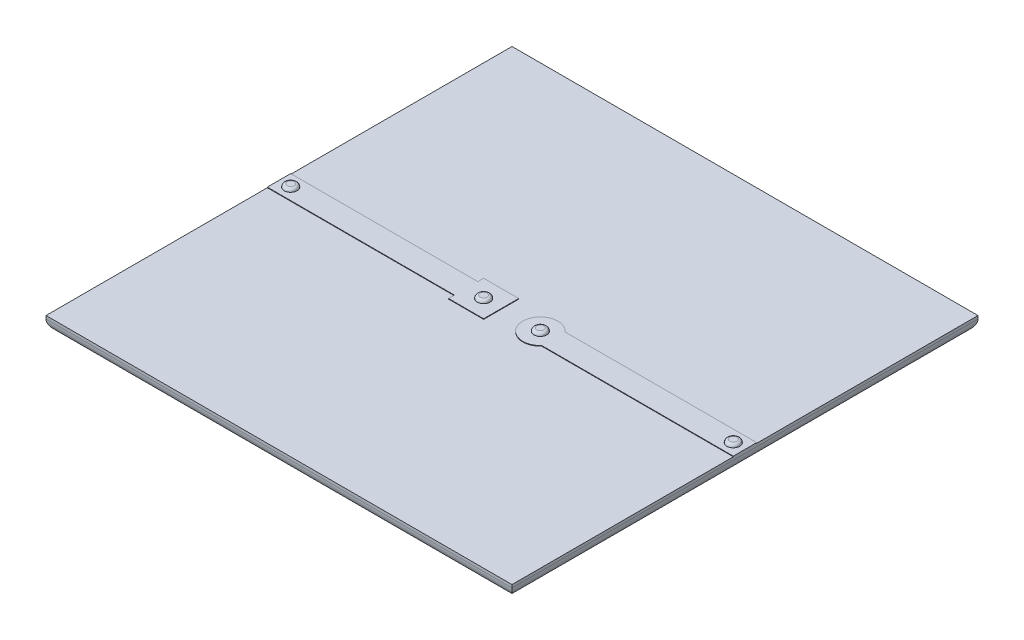
ISO-10303-21;
HEADER;
FILE_DESCRIPTION(('STEP AP214'),'2;1');
FILE_NAME('part.step','',(''),(''),'','','');
FILE_SCHEMA(('AUTOMOTIVE_DESIGN { 1 0 10303 214 1 1 1 1 }'));
ENDSEC;
DATA;
#1=APPLICATION_CONTEXT('core data for automotive mechanical design processes');
#2=APPLICATION_PROTOCOL_DEFINITION('international standard','automotive_design',2000,#1);
#3=PRODUCT_CONTEXT('',#1,'mechanical');
#4=PRODUCT('Part','Part','',(#3));
#5=PRODUCT_RELATED_PRODUCT_CATEGORY('part','',(#4));
#6=PRODUCT_DEFINITION_FORMATION('','',#4);
#7=PRODUCT_DEFINITION_CONTEXT('part definition',#1,'design');
#8=PRODUCT_DEFINITION('design','',#6,#7);
#9=PRODUCT_DEFINITION_SHAPE('','',#8);
#10=(LENGTH_UNIT() NAMED_UNIT(*) SI_UNIT(.MILLI.,.METRE.));
#11=(NAMED_UNIT(*) PLANE_ANGLE_UNIT() SI_UNIT($,.RADIAN.));
#12=(NAMED_UNIT(*) SI_UNIT($,.STERADIAN.) SOLID_ANGLE_UNIT());
#13=UNCERTAINTY_MEASURE_WITH_UNIT(LENGTH_MEASURE(1.E-05),#10,'distance_accuracy_value','');
#14=(GEOMETRIC_REPRESENTATION_CONTEXT(3) GLOBAL_UNCERTAINTY_ASSIGNED_CONTEXT((#13)) GLOBAL_UNIT_ASSIGNED_CONTEXT((#10,
#11,#12)) REPRESENTATION_CONTEXT('',''));
#15=CARTESIAN_POINT('',(0.,0.,0.));
#16=DIRECTION('',(0.,0.,1.));
#17=DIRECTION('',(1.,0.,0.));
#18=AXIS2_PLACEMENT_3D('',#15,#16,#17);
#19=CARTESIAN_POINT('',(0.,0.,0.));
#20=DIRECTION('',(0.,-1.,0.));
#21=DIRECTION('',(0.,0.,-1.));
#22=AXIS2_PLACEMENT_3D('',#19,#20,#21);
#23=PLANE('',#22);
#24=DIRECTION('',(0.,0.,1.));
#25=VECTOR('',#24,1.);
#26=CARTESIAN_POINT('',(-7.84999999999999,0.,-3.));
#27=LINE('',#26,#25);
#28=CARTESIAN_POINT('',(-7.84999999999999,0.,-3.));
#29=VERTEX_POINT('',#28);
#30=CARTESIAN_POINT('',(-7.84999999999999,0.,-2.));
#31=VERTEX_POINT('',#30);
#32=EDGE_CURVE('E394',#29,#31,#27,.T.);
#33=ORIENTED_EDGE('',*,*,#32,.F.);
#34=DIRECTION('',(-1.,0.,0.));
#35=VECTOR('',#34,1.);
#36=CARTESIAN_POINT('',(-7.84999999999999,0.,-3.));
#37=LINE('',#36,#35);
#38=CARTESIAN_POINT('',(-1.84999999999999,0.,-3.));
#39=VERTEX_POINT('',#38);
#40=EDGE_CURVE('E391',#39,#29,#37,.T.);
#41=ORIENTED_EDGE('',*,*,#40,.F.);
#42=DIRECTION('',(0.,0.,-1.));
#43=VECTOR('',#42,1.);
#44=CARTESIAN_POINT('',(-1.84999999999999,0.,-3.));
#45=LINE('',#44,#43);
#46=CARTESIAN_POINT('',(-1.84999999999999,0.,3.));
#47=VERTEX_POINT('',#46);
#48=EDGE_CURVE('E186',#47,#39,#45,.T.);
#49=ORIENTED_EDGE('',*,*,#48,.F.);
#50=DIRECTION('',(1.,0.,0.));
#51=VECTOR('',#50,1.);
#52=CARTESIAN_POINT('',(-7.84999999999999,0.,3.));
#53=LINE('',#52,#51);
#54=CARTESIAN_POINT('',(-7.84999999999999,0.,3.));
#55=VERTEX_POINT('',#54);
#56=EDGE_CURVE('E182',#55,#47,#53,.T.);
#57=ORIENTED_EDGE('',*,*,#56,.F.);
#58=CARTESIAN_POINT('',(-7.84999999999999,0.,2.));
#59=VERTEX_POINT('',#58);
#60=EDGE_CURVE('E393',#59,#55,#27,.T.);
#61=ORIENTED_EDGE('',*,*,#60,.F.);
#62=DIRECTION('',(1.,0.,0.));
#63=VECTOR('',#62,1.);
#64=CARTESIAN_POINT('',(-2.84999999999999,0.,2.));
#65=LINE('',#64,#63);
#66=CARTESIAN_POINT('',(-39.85,0.,1.99999999999999));
#67=VERTEX_POINT('',#66);
#68=EDGE_CURVE('E207',#67,#59,#65,.T.);
#69=ORIENTED_EDGE('',*,*,#68,.F.);
#70=DIRECTION('',(0.,0.,1.));
#71=VECTOR('',#70,1.);
#72=CARTESIAN_POINT('',(-39.85,0.,-39.85));
#73=LINE('',#72,#71);
#74=CARTESIAN_POINT('',(-39.85,0.,39.85));
#75=VERTEX_POINT('',#74);
#76=EDGE_CURVE('E243',#67,#75,#73,.T.);
#77=ORIENTED_EDGE('',*,*,#76,.T.);
#78=DIRECTION('',(1.,0.,0.));
#79=VECTOR('',#78,1.);
#80=CARTESIAN_POINT('',(39.85,0.,39.85));
#81=LINE('',#80,#79);
#82=CARTESIAN_POINT('',(39.85,0.,39.85));
#83=VERTEX_POINT('',#82);
#84=EDGE_CURVE('E242',#75,#83,#81,.T.);
#85=ORIENTED_EDGE('',*,*,#84,.T.);
#86=DIRECTION('',(0.,0.,-1.));
#87=VECTOR('',#86,1.);
#88=CARTESIAN_POINT('',(39.85,0.,-39.85));
#89=LINE('',#88,#87);
#90=CARTESIAN_POINT('',(39.85,0.,2.));
#91=VERTEX_POINT('',#90);
#92=EDGE_CURVE('E247',#83,#91,#89,.T.);
#93=ORIENTED_EDGE('',*,*,#92,.T.);
#94=DIRECTION('',(1.,0.,0.));
#95=VECTOR('',#94,1.);
#96=CARTESIAN_POINT('',(39.85,0.,2.));
#97=LINE('',#96,#95);
#98=CARTESIAN_POINT('',(7.08606797749979,0.,2.));
#99=VERTEX_POINT('',#98);
#100=EDGE_CURVE('E226',#99,#91,#97,.T.);
#101=ORIENTED_EDGE('',*,*,#100,.F.);
#102=CARTESIAN_POINT('',(4.85,0.,0.));
#103=DIRECTION('',(0.,1.,0.));
#104=DIRECTION('',(0.,0.,1.));
#105=AXIS2_PLACEMENT_3D('',#102,#103,#104);
#106=CIRCLE('',#105,3.);
#107=CARTESIAN_POINT('',(7.0860679774998,0.,-2.));
#108=VERTEX_POINT('',#107);
#109=EDGE_CURVE('E197',#108,#99,#106,.T.);
#110=ORIENTED_EDGE('',*,*,#109,.F.);
#111=DIRECTION('',(-1.,0.,0.));
#112=VECTOR('',#111,1.);
#113=CARTESIAN_POINT('',(39.85,0.,-2.));
#114=LINE('',#113,#112);
#115=CARTESIAN_POINT('',(39.85,0.,-1.99999999999999));
#116=VERTEX_POINT('',#115);
#117=EDGE_CURVE('E221',#116,#108,#114,.T.);
#118=ORIENTED_EDGE('',*,*,#117,.F.);
#119=CARTESIAN_POINT('',(39.85,0.,-39.85));
#120=VERTEX_POINT('',#119);
#121=EDGE_CURVE('E246',#116,#120,#89,.T.);
#122=ORIENTED_EDGE('',*,*,#121,.T.);
#123=DIRECTION('',(-1.,0.,0.));
#124=VECTOR('',#123,1.);
#125=CARTESIAN_POINT('',(39.85,0.,-39.85));
#126=LINE('',#125,#124);
#127=CARTESIAN_POINT('',(-39.85,0.,-39.85));
#128=VERTEX_POINT('',#127);
#129=EDGE_CURVE('E250',#120,#128,#126,.T.);
#130=ORIENTED_EDGE('',*,*,#129,.T.);
#131=CARTESIAN_POINT('',(-39.85,0.,-2.));
#132=VERTEX_POINT('',#131);
#133=EDGE_CURVE('E240',#128,#132,#73,.T.);
#134=ORIENTED_EDGE('',*,*,#133,.T.);
#135=DIRECTION('',(-1.,0.,0.));
#136=VECTOR('',#135,1.);
#137=CARTESIAN_POINT('',(-2.84999999999999,0.,-2.));
#138=LINE('',#137,#136);
#139=EDGE_CURVE('E58',#31,#132,#138,.T.);
#140=ORIENTED_EDGE('',*,*,#139,.F.);
#141=EDGE_LOOP('',(#33,#41,#49,#57,#61,#69,#77,#85,#93,#101,#110,#118,#122,#130,#134,#140));
#142=FACE_BOUND('',#141,.T.);
#143=ADVANCED_FACE('F35',(#142),#23,.F.);
#144=CARTESIAN_POINT('',(-2.84999999999999,0.1,-2.));
#145=DIRECTION('',(0.,0.,1.));
#146=DIRECTION('',(1.,0.,0.));
#147=AXIS2_PLACEMENT_3D('',#144,#145,#146);
#148=PLANE('',#147);
#149=DIRECTION('',(0.,1.,0.));
#150=VECTOR('',#149,1.);
#151=CARTESIAN_POINT('',(-7.84999999999999,0.1,-2.));
#152=LINE('',#151,#150);
#153=CARTESIAN_POINT('',(-7.84999999999999,0.1,-2.));
#154=VERTEX_POINT('',#153);
#155=EDGE_CURVE('E190',#31,#154,#152,.T.);
#156=ORIENTED_EDGE('',*,*,#155,.F.);
#157=ORIENTED_EDGE('',*,*,#139,.T.);
#158=DIRECTION('',(0.,-1.,0.));
#159=VECTOR('',#158,1.);
#160=CARTESIAN_POINT('',(-39.85,0.1,-1.99999999999999));
#161=LINE('',#160,#159);
#162=CARTESIAN_POINT('',(-39.85,0.1,-1.99999999999999));
#163=VERTEX_POINT('',#162);
#164=EDGE_CURVE('E218',#163,#132,#161,.T.);
#165=ORIENTED_EDGE('',*,*,#164,.F.);
#166=DIRECTION('',(-1.,0.,0.));
#167=VECTOR('',#166,1.);
#168=CARTESIAN_POINT('',(-2.84999999999999,0.1,-2.));
#169=LINE('',#168,#167);
#170=EDGE_CURVE('E204',#154,#163,#169,.T.);
#171=ORIENTED_EDGE('',*,*,#170,.F.);
#172=EDGE_LOOP('',(#156,#157,#165,#171));
#173=FACE_BOUND('',#172,.T.);
#174=ADVANCED_FACE('F314',(#173),#148,.F.);
#175=CARTESIAN_POINT('',(-2.84999999999999,0.1,2.));
#176=DIRECTION('',(0.,0.,-1.));
#177=DIRECTION('',(-1.,0.,0.));
#178=AXIS2_PLACEMENT_3D('',#175,#176,#177);
#179=PLANE('',#178);
#180=DIRECTION('',(0.,-1.,0.));
#181=VECTOR('',#180,1.);
#182=CARTESIAN_POINT('',(-7.84999999999999,0.1,2.));
#183=LINE('',#182,#181);
#184=CARTESIAN_POINT('',(-7.84999999999999,0.1,2.));
#185=VERTEX_POINT('',#184);
#186=EDGE_CURVE('E188',#185,#59,#183,.T.);
#187=ORIENTED_EDGE('',*,*,#186,.F.);
#188=DIRECTION('',(1.,0.,0.));
#189=VECTOR('',#188,1.);
#190=CARTESIAN_POINT('',(-2.84999999999999,0.1,2.));
#191=LINE('',#190,#189);
#192=CARTESIAN_POINT('',(-39.85,0.1,1.99999999999999));
#193=VERTEX_POINT('',#192);
#194=EDGE_CURVE('E209',#193,#185,#191,.T.);
#195=ORIENTED_EDGE('',*,*,#194,.F.);
#196=DIRECTION('',(0.,-1.,0.));
#197=VECTOR('',#196,1.);
#198=CARTESIAN_POINT('',(-39.85,0.1,1.99999999999999));
#199=LINE('',#198,#197);
#200=EDGE_CURVE('E212',#193,#67,#199,.T.);
#201=ORIENTED_EDGE('',*,*,#200,.T.);
#202=ORIENTED_EDGE('',*,*,#68,.T.);
#203=EDGE_LOOP('',(#187,#195,#201,#202));
#204=FACE_BOUND('',#203,.T.);
#205=ADVANCED_FACE('F320',(#204),#179,.F.);
#206=CARTESIAN_POINT('',(39.85,0.1,-2.));
#207=DIRECTION('',(0.,0.,1.));
#208=DIRECTION('',(1.,0.,0.));
#209=AXIS2_PLACEMENT_3D('',#206,#207,#208);
#210=PLANE('',#209);
#211=DIRECTION('',(0.,-1.,0.));
#212=VECTOR('',#211,1.);
#213=CARTESIAN_POINT('',(7.0860679774998,0.1,-2.));
#214=LINE('',#213,#212);
#215=CARTESIAN_POINT('',(7.0860679774998,0.1,-2.));
#216=VERTEX_POINT('',#215);
#217=EDGE_CURVE('E202',#216,#108,#214,.T.);
#218=ORIENTED_EDGE('',*,*,#217,.F.);
#219=DIRECTION('',(-1.,0.,0.));
#220=VECTOR('',#219,1.);
#221=CARTESIAN_POINT('',(39.85,0.1,-2.));
#222=LINE('',#221,#220);
#223=CARTESIAN_POINT('',(39.85,0.1,-2.));
#224=VERTEX_POINT('',#223);
#225=EDGE_CURVE('E225',#224,#216,#222,.T.);
#226=ORIENTED_EDGE('',*,*,#225,.F.);
#227=DIRECTION('',(0.,-1.,0.));
#228=VECTOR('',#227,1.);
#229=CARTESIAN_POINT('',(39.85,0.1,-2.));
#230=LINE('',#229,#228);
#231=EDGE_CURVE('E236',#224,#116,#230,.T.);
#232=ORIENTED_EDGE('',*,*,#231,.T.);
#233=ORIENTED_EDGE('',*,*,#117,.T.);
#234=EDGE_LOOP('',(#218,#226,#232,#233));
#235=FACE_BOUND('',#234,.T.);
#236=ADVANCED_FACE('F435',(#235),#210,.F.);
#237=CARTESIAN_POINT('',(39.85,0.1,2.));
#238=DIRECTION('',(0.,0.,-1.));
#239=DIRECTION('',(-1.,0.,0.));
#240=AXIS2_PLACEMENT_3D('',#237,#238,#239);
#241=PLANE('',#240);
#242=DIRECTION('',(0.,-1.,0.));
#243=VECTOR('',#242,1.);
#244=CARTESIAN_POINT('',(7.08606797749979,0.1,2.));
#245=LINE('',#244,#243);
#246=CARTESIAN_POINT('',(7.08606797749979,0.1,2.));
#247=VERTEX_POINT('',#246);
#248=EDGE_CURVE('E199',#99,#247,#245,.F.);
#249=ORIENTED_EDGE('',*,*,#248,.F.);
#250=ORIENTED_EDGE('',*,*,#100,.T.);
#251=DIRECTION('',(0.,-1.,0.));
#252=VECTOR('',#251,1.);
#253=CARTESIAN_POINT('',(39.85,0.1,2.));
#254=LINE('',#253,#252);
#255=CARTESIAN_POINT('',(39.85,0.1,2.));
#256=VERTEX_POINT('',#255);
#257=EDGE_CURVE('E230',#256,#91,#254,.T.);
#258=ORIENTED_EDGE('',*,*,#257,.F.);
#259=DIRECTION('',(1.,0.,0.));
#260=VECTOR('',#259,1.);
#261=CARTESIAN_POINT('',(39.85,0.1,2.));
#262=LINE('',#261,#260);
#263=EDGE_CURVE('E228',#247,#256,#262,.T.);
#264=ORIENTED_EDGE('',*,*,#263,.F.);
#265=EDGE_LOOP('',(#249,#250,#258,#264));
#266=FACE_BOUND('',#265,.T.);
#267=ADVANCED_FACE('F342',(#266),#241,.F.);
#268=CARTESIAN_POINT('',(-39.85,-2.5,-39.85));
#269=DIRECTION('',(-1.,0.,0.));
#270=DIRECTION('',(0.,0.,1.));
#271=AXIS2_PLACEMENT_3D('',#268,#269,#270);
#272=PLANE('',#271);
#273=DIRECTION('',(0.,1.,0.));
#274=VECTOR('',#273,1.);
#275=CARTESIAN_POINT('',(-39.85,-2.5,-39.85));
#276=LINE('',#275,#274);
#277=CARTESIAN_POINT('',(-39.85,-0.5,-39.85));
#278=VERTEX_POINT('',#277);
#279=EDGE_CURVE('E254',#278,#128,#276,.T.);
#280=ORIENTED_EDGE('',*,*,#279,.F.);
#281=DIRECTION('',(0.,0.,1.));
#282=VECTOR('',#281,1.);
#283=CARTESIAN_POINT('',(-39.85,-0.5,-39.85));
#284=LINE('',#283,#282);
#285=CARTESIAN_POINT('',(-39.85,-0.5,39.85));
#286=VERTEX_POINT('',#285);
#287=EDGE_CURVE('E256',#278,#286,#284,.T.);
#288=ORIENTED_EDGE('',*,*,#287,.T.);
#289=DIRECTION('',(0.,1.,0.));
#290=VECTOR('',#289,1.);
#291=CARTESIAN_POINT('',(-39.85,-2.5,39.85));
#292=LINE('',#291,#290);
#293=EDGE_CURVE('E253',#286,#75,#292,.T.);
#294=ORIENTED_EDGE('',*,*,#293,.T.);
#295=ORIENTED_EDGE('',*,*,#76,.F.);
#296=ORIENTED_EDGE('',*,*,#200,.F.);
#297=DIRECTION('',(0.,0.,1.));
#298=VECTOR('',#297,1.);
#299=CARTESIAN_POINT('',(-39.85,0.1,1.99999999999999));
#300=LINE('',#299,#298);
#301=EDGE_CURVE('E206',#163,#193,#300,.T.);
#302=ORIENTED_EDGE('',*,*,#301,.F.);
#303=ORIENTED_EDGE('',*,*,#164,.T.);
#304=ORIENTED_EDGE('',*,*,#133,.F.);
#305=EDGE_LOOP('',(#280,#288,#294,#295,#296,#302,#303,#304));
#306=FACE_BOUND('',#305,.T.);
#307=ADVANCED_FACE('F331',(#306),#272,.T.);
#308=CARTESIAN_POINT('',(39.85,-2.5,-39.85));
#309=DIRECTION('',(0.,0.,-1.));
#310=DIRECTION('',(-1.,0.,0.));
#311=AXIS2_PLACEMENT_3D('',#308,#309,#310);
#312=PLANE('',#311);
#313=DIRECTION('',(0.,1.,0.));
#314=VECTOR('',#313,1.);
#315=CARTESIAN_POINT('',(39.85,-2.5,-39.85));
#316=LINE('',#315,#314);
#317=CARTESIAN_POINT('',(39.85,-0.5,-39.85));
#318=VERTEX_POINT('',#317);
#319=EDGE_CURVE('E257',#318,#120,#316,.T.);
#320=ORIENTED_EDGE('',*,*,#319,.F.);
#321=DIRECTION('',(-1.,0.,0.));
#322=VECTOR('',#321,1.);
#323=CARTESIAN_POINT('',(39.85,-0.5,-39.85));
#324=LINE('',#323,#322);
#325=EDGE_CURVE('E275',#318,#278,#324,.T.);
#326=ORIENTED_EDGE('',*,*,#325,.T.);
#327=ORIENTED_EDGE('',*,*,#279,.T.);
#328=ORIENTED_EDGE('',*,*,#129,.F.);
#329=EDGE_LOOP('',(#320,#326,#327,#328));
#330=FACE_BOUND('',#329,.T.);
#331=ADVANCED_FACE('F327',(#330),#312,.T.);
#332=CARTESIAN_POINT('',(39.85,-2.5,-39.85));
#333=DIRECTION('',(1.,0.,0.));
#334=DIRECTION('',(0.,0.,-1.));
#335=AXIS2_PLACEMENT_3D('',#332,#333,#334);
#336=PLANE('',#335);
#337=DIRECTION('',(0.,1.,0.));
#338=VECTOR('',#337,1.);
#339=CARTESIAN_POINT('',(39.85,-2.5,39.85));
#340=LINE('',#339,#338);
#341=CARTESIAN_POINT('',(39.85,-0.5,39.85));
#342=VERTEX_POINT('',#341);
#343=EDGE_CURVE('E260',#342,#83,#340,.T.);
#344=ORIENTED_EDGE('',*,*,#343,.F.);
#345=DIRECTION('',(0.,0.,-1.));
#346=VECTOR('',#345,1.);
#347=CARTESIAN_POINT('',(39.85,-0.5,-39.85));
#348=LINE('',#347,#346);
#349=EDGE_CURVE('E277',#342,#318,#348,.T.);
#350=ORIENTED_EDGE('',*,*,#349,.T.);
#351=ORIENTED_EDGE('',*,*,#319,.T.);
#352=ORIENTED_EDGE('',*,*,#121,.F.);
#353=ORIENTED_EDGE('',*,*,#231,.F.);
#354=DIRECTION('',(0.,0.,-1.));
#355=VECTOR('',#354,1.);
#356=CARTESIAN_POINT('',(39.85,0.1,2.));
#357=LINE('',#356,#355);
#358=EDGE_CURVE('E222',#256,#224,#357,.T.);
#359=ORIENTED_EDGE('',*,*,#358,.F.);
#360=ORIENTED_EDGE('',*,*,#257,.T.);
#361=ORIENTED_EDGE('',*,*,#92,.F.);
#362=EDGE_LOOP('',(#344,#350,#351,#352,#353,#359,#360,#361));
#363=FACE_BOUND('',#362,.T.);
#364=ADVANCED_FACE('F330',(#363),#336,.T.);
#365=CARTESIAN_POINT('',(39.85,-2.5,39.85));
#366=DIRECTION('',(0.,0.,1.));
#367=DIRECTION('',(1.,0.,0.));
#368=AXIS2_PLACEMENT_3D('',#365,#366,#367);
#369=PLANE('',#368);
#370=ORIENTED_EDGE('',*,*,#293,.F.);
#371=DIRECTION('',(1.,0.,0.));
#372=VECTOR('',#371,1.);
#373=CARTESIAN_POINT('',(39.85,-0.5,39.85));
#374=LINE('',#373,#372);
#375=EDGE_CURVE('E279',#286,#342,#374,.T.);
#376=ORIENTED_EDGE('',*,*,#375,.T.);
#377=ORIENTED_EDGE('',*,*,#343,.T.);
#378=ORIENTED_EDGE('',*,*,#84,.F.);
#379=EDGE_LOOP('',(#370,#376,#377,#378));
#380=FACE_BOUND('',#379,.T.);
#381=ADVANCED_FACE('F335',(#380),#369,.T.);
#382=CARTESIAN_POINT('',(0.,-2.5,0.));
#383=DIRECTION('',(0.,-1.,0.));
#384=DIRECTION('',(0.,0.,-1.));
#385=AXIS2_PLACEMENT_3D('',#382,#383,#384);
#386=PLANE('',#385);
#387=DIRECTION('',(1.,0.,0.));
#388=VECTOR('',#387,1.);
#389=CARTESIAN_POINT('',(0.,-2.5,37.85));
#390=LINE('',#389,#388);
#391=CARTESIAN_POINT('',(37.85,-2.5,37.85));
#392=VERTEX_POINT('',#391);
#393=CARTESIAN_POINT('',(-37.85,-2.5,37.85));
#394=VERTEX_POINT('',#393);
#395=EDGE_CURVE('E266',#392,#394,#390,.F.);
#396=ORIENTED_EDGE('',*,*,#395,.T.);
#397=DIRECTION('',(0.,0.,1.));
#398=VECTOR('',#397,1.);
#399=CARTESIAN_POINT('',(-37.85,-2.5,0.));
#400=LINE('',#399,#398);
#401=CARTESIAN_POINT('',(-37.85,-2.5,-37.85));
#402=VERTEX_POINT('',#401);
#403=EDGE_CURVE('E272',#394,#402,#400,.F.);
#404=ORIENTED_EDGE('',*,*,#403,.T.);
#405=DIRECTION('',(-1.,0.,0.));
#406=VECTOR('',#405,1.);
#407=CARTESIAN_POINT('',(0.,-2.5,-37.85));
#408=LINE('',#407,#406);
#409=CARTESIAN_POINT('',(37.85,-2.5,-37.85));
#410=VERTEX_POINT('',#409);
#411=EDGE_CURVE('E270',#402,#410,#408,.F.);
#412=ORIENTED_EDGE('',*,*,#411,.T.);
#413=DIRECTION('',(0.,0.,-1.));
#414=VECTOR('',#413,1.);
#415=CARTESIAN_POINT('',(37.85,-2.5,0.));
#416=LINE('',#415,#414);
#417=EDGE_CURVE('E268',#410,#392,#416,.F.);
#418=ORIENTED_EDGE('',*,*,#417,.T.);
#419=EDGE_LOOP('',(#396,#404,#412,#418));
#420=FACE_BOUND('',#419,.T.);
#421=ADVANCED_FACE('F325',(#420),#386,.T.);
#422=CARTESIAN_POINT('',(37.85,-0.5,-39.85));
#423=DIRECTION('',(0.,0.,-1.));
#424=DIRECTION('',(-1.,0.,0.));
#425=AXIS2_PLACEMENT_3D('',#422,#423,#424);
#426=CYLINDRICAL_SURFACE('',#425,2.);
#427=CARTESIAN_POINT('',(37.85,-0.5,37.85));
#428=DIRECTION('',(0.707106781186547,0.,-0.707106781186548));
#429=DIRECTION('',(0.707106781186548,0.,0.707106781186547));
#430=AXIS2_PLACEMENT_3D('',#427,#428,#429);
#431=ELLIPSE('',#430,2.82842712474619,2.);
#432=EDGE_CURVE('E285',#392,#342,#431,.F.);
#433=ORIENTED_EDGE('',*,*,#432,.F.);
#434=ORIENTED_EDGE('',*,*,#417,.F.);
#435=CARTESIAN_POINT('',(37.85,-0.5,-37.85));
#436=DIRECTION('',(-0.707106781186548,0.,-0.707106781186547));
#437=DIRECTION('',(0.707106781186547,0.,-0.707106781186548));
#438=AXIS2_PLACEMENT_3D('',#435,#436,#437);
#439=ELLIPSE('',#438,2.82842712474619,2.);
#440=EDGE_CURVE('E288',#318,#410,#439,.T.);
#441=ORIENTED_EDGE('',*,*,#440,.F.);
#442=ORIENTED_EDGE('',*,*,#349,.F.);
#443=EDGE_LOOP('',(#433,#434,#441,#442));
#444=FACE_BOUND('',#443,.T.);
#445=ADVANCED_FACE('F356',(#444),#426,.T.);
#446=CARTESIAN_POINT('',(39.85,-0.5,-37.85));
#447=DIRECTION('',(-1.,0.,0.));
#448=DIRECTION('',(0.,0.,1.));
#449=AXIS2_PLACEMENT_3D('',#446,#447,#448);
#450=CYLINDRICAL_SURFACE('',#449,2.);
#451=ORIENTED_EDGE('',*,*,#440,.T.);
#452=ORIENTED_EDGE('',*,*,#411,.F.);
#453=CARTESIAN_POINT('',(-37.85,-0.5,-37.85));
#454=DIRECTION('',(-0.707106781186547,0.,0.707106781186548));
#455=DIRECTION('',(-0.707106781186548,0.,-0.707106781186547));
#456=AXIS2_PLACEMENT_3D('',#453,#454,#455);
#457=ELLIPSE('',#456,2.82842712474619,2.);
#458=EDGE_CURVE('E283',#278,#402,#457,.T.);
#459=ORIENTED_EDGE('',*,*,#458,.F.);
#460=ORIENTED_EDGE('',*,*,#325,.F.);
#461=EDGE_LOOP('',(#451,#452,#459,#460));
#462=FACE_BOUND('',#461,.T.);
#463=ADVANCED_FACE('F352',(#462),#450,.T.);
#464=CARTESIAN_POINT('',(39.85,-0.5,37.85));
#465=DIRECTION('',(1.,0.,0.));
#466=DIRECTION('',(0.,0.,-1.));
#467=AXIS2_PLACEMENT_3D('',#464,#465,#466);
#468=CYLINDRICAL_SURFACE('',#467,2.);
#469=ORIENTED_EDGE('',*,*,#432,.T.);
#470=ORIENTED_EDGE('',*,*,#375,.F.);
#471=CARTESIAN_POINT('',(-37.85,-0.5,37.85));
#472=DIRECTION('',(0.707106781186548,0.,0.707106781186547));
#473=DIRECTION('',(0.707106781186547,0.,-0.707106781186548));
#474=AXIS2_PLACEMENT_3D('',#471,#472,#473);
#475=ELLIPSE('',#474,2.82842712474619,2.);
#476=EDGE_CURVE('E239',#394,#286,#475,.F.);
#477=ORIENTED_EDGE('',*,*,#476,.F.);
#478=ORIENTED_EDGE('',*,*,#395,.F.);
#479=EDGE_LOOP('',(#469,#470,#477,#478));
#480=FACE_BOUND('',#479,.T.);
#481=ADVANCED_FACE('F348',(#480),#468,.T.);
#482=CARTESIAN_POINT('',(-37.85,-0.5,-39.85));
#483=DIRECTION('',(0.,0.,1.));
#484=DIRECTION('',(1.,0.,0.));
#485=AXIS2_PLACEMENT_3D('',#482,#483,#484);
#486=CYLINDRICAL_SURFACE('',#485,2.);
#487=ORIENTED_EDGE('',*,*,#458,.T.);
#488=ORIENTED_EDGE('',*,*,#403,.F.);
#489=ORIENTED_EDGE('',*,*,#476,.T.);
#490=ORIENTED_EDGE('',*,*,#287,.F.);
#491=EDGE_LOOP('',(#487,#488,#489,#490));
#492=FACE_BOUND('',#491,.T.);
#493=ADVANCED_FACE('F344',(#492),#486,.T.);
#494=CARTESIAN_POINT('',(0.,0.1,0.));
#495=DIRECTION('',(0.,1.,0.));
#496=DIRECTION('',(0.,0.,1.));
#497=AXIS2_PLACEMENT_3D('',#494,#495,#496);
#498=PLANE('',#497);
#499=CARTESIAN_POINT('',(37.85,0.1,0.));
#500=DIRECTION('',(0.,1.,0.));
#501=DIRECTION('',(0.,0.,1.));
#502=AXIS2_PLACEMENT_3D('',#499,#500,#501);
#503=CIRCLE('',#502,1.1);
#504=CARTESIAN_POINT('',(37.85,0.1,1.1));
#505=VERTEX_POINT('',#504);
#506=EDGE_CURVE('E376',#505,#505,#503,.T.);
#507=ORIENTED_EDGE('',*,*,#506,.F.);
#508=EDGE_LOOP('',(#507));
#509=FACE_BOUND('',#508,.T.);
#510=CARTESIAN_POINT('',(4.85,0.1,0.));
#511=DIRECTION('',(0.,1.,0.));
#512=DIRECTION('',(0.,0.,1.));
#513=AXIS2_PLACEMENT_3D('',#510,#511,#512);
#514=CIRCLE('',#513,1.1);
#515=CARTESIAN_POINT('',(4.85,0.1,1.1));
#516=VERTEX_POINT('',#515);
#517=EDGE_CURVE('E384',#516,#516,#514,.T.);
#518=ORIENTED_EDGE('',*,*,#517,.F.);
#519=EDGE_LOOP('',(#518));
#520=FACE_BOUND('',#519,.T.);
#521=ORIENTED_EDGE('',*,*,#225,.T.);
#522=CARTESIAN_POINT('',(4.85,0.1,0.));
#523=DIRECTION('',(0.,1.,0.));
#524=DIRECTION('',(0.,0.,1.));
#525=AXIS2_PLACEMENT_3D('',#522,#523,#524);
#526=CIRCLE('',#525,3.);
#527=EDGE_CURVE('E50',#216,#247,#526,.T.);
#528=ORIENTED_EDGE('',*,*,#527,.T.);
#529=ORIENTED_EDGE('',*,*,#263,.T.);
#530=ORIENTED_EDGE('',*,*,#358,.T.);
#531=EDGE_LOOP('',(#521,#528,#529,#530));
#532=FACE_BOUND('',#531,.T.);
#533=ADVANCED_FACE('F347',(#509,#520,#532),#498,.T.);
#534=CARTESIAN_POINT('',(0.,0.1,0.));
#535=DIRECTION('',(0.,1.,0.));
#536=DIRECTION('',(0.,0.,1.));
#537=AXIS2_PLACEMENT_3D('',#534,#535,#536);
#538=PLANE('',#537);
#539=CARTESIAN_POINT('',(-37.85,0.1,0.));
#540=DIRECTION('',(0.,1.,0.));
#541=DIRECTION('',(0.,0.,1.));
#542=AXIS2_PLACEMENT_3D('',#539,#540,#541);
#543=CIRCLE('',#542,1.1);
#544=CARTESIAN_POINT('',(-37.85,0.1,1.1));
#545=VERTEX_POINT('',#544);
#546=EDGE_CURVE('E373',#545,#545,#543,.T.);
#547=ORIENTED_EDGE('',*,*,#546,.F.);
#548=EDGE_LOOP('',(#547));
#549=FACE_BOUND('',#548,.T.);
#550=CARTESIAN_POINT('',(-4.84999999999999,0.1,0.));
#551=DIRECTION('',(0.,1.,0.));
#552=DIRECTION('',(0.,0.,1.));
#553=AXIS2_PLACEMENT_3D('',#550,#551,#552);
#554=CIRCLE('',#553,1.1);
#555=CARTESIAN_POINT('',(-4.84999999999999,0.1,1.1));
#556=VERTEX_POINT('',#555);
#557=EDGE_CURVE('E379',#556,#556,#554,.T.);
#558=ORIENTED_EDGE('',*,*,#557,.F.);
#559=EDGE_LOOP('',(#558));
#560=FACE_BOUND('',#559,.T.);
#561=DIRECTION('',(0.,0.,1.));
#562=VECTOR('',#561,1.);
#563=CARTESIAN_POINT('',(-7.84999999999999,0.1,-3.));
#564=LINE('',#563,#562);
#565=CARTESIAN_POINT('',(-7.84999999999999,0.1,-3.));
#566=VERTEX_POINT('',#565);
#567=EDGE_CURVE('E386',#566,#154,#564,.T.);
#568=ORIENTED_EDGE('',*,*,#567,.T.);
#569=ORIENTED_EDGE('',*,*,#170,.T.);
#570=ORIENTED_EDGE('',*,*,#301,.T.);
#571=ORIENTED_EDGE('',*,*,#194,.T.);
#572=CARTESIAN_POINT('',(-7.84999999999999,0.1,3.));
#573=VERTEX_POINT('',#572);
#574=EDGE_CURVE('E172',#185,#573,#564,.T.);
#575=ORIENTED_EDGE('',*,*,#574,.T.);
#576=DIRECTION('',(1.,0.,0.));
#577=VECTOR('',#576,1.);
#578=CARTESIAN_POINT('',(-7.84999999999999,0.1,3.));
#579=LINE('',#578,#577);
#580=CARTESIAN_POINT('',(-1.84999999999999,0.1,3.));
#581=VERTEX_POINT('',#580);
#582=EDGE_CURVE('E178',#573,#581,#579,.T.);
#583=ORIENTED_EDGE('',*,*,#582,.T.);
#584=DIRECTION('',(0.,0.,-1.));
#585=VECTOR('',#584,1.);
#586=CARTESIAN_POINT('',(-1.84999999999999,0.1,-3.));
#587=LINE('',#586,#585);
#588=CARTESIAN_POINT('',(-1.84999999999999,0.1,-3.));
#589=VERTEX_POINT('',#588);
#590=EDGE_CURVE('E173',#581,#589,#587,.T.);
#591=ORIENTED_EDGE('',*,*,#590,.T.);
#592=DIRECTION('',(-1.,0.,0.));
#593=VECTOR('',#592,1.);
#594=CARTESIAN_POINT('',(-7.84999999999999,0.1,-3.));
#595=LINE('',#594,#593);
#596=EDGE_CURVE('E161',#589,#566,#595,.T.);
#597=ORIENTED_EDGE('',*,*,#596,.T.);
#598=EDGE_LOOP('',(#568,#569,#570,#571,#575,#583,#591,#597));
#599=FACE_BOUND('',#598,.T.);
#600=ADVANCED_FACE('F176',(#549,#560,#599),#538,.T.);
#601=CARTESIAN_POINT('',(4.85,0.1,0.));
#602=DIRECTION('',(0.,-1.,0.));
#603=DIRECTION('',(0.,0.,-1.));
#604=AXIS2_PLACEMENT_3D('',#601,#602,#603);
#605=CYLINDRICAL_SURFACE('',#604,3.);
#606=ORIENTED_EDGE('',*,*,#527,.F.);
#607=ORIENTED_EDGE('',*,*,#217,.T.);
#608=ORIENTED_EDGE('',*,*,#109,.T.);
#609=ORIENTED_EDGE('',*,*,#248,.T.);
#610=EDGE_LOOP('',(#606,#607,#608,#609));
#611=FACE_BOUND('',#610,.T.);
#612=ADVANCED_FACE('F423',(#611),#605,.T.);
#613=CARTESIAN_POINT('',(-7.84999999999999,0.1,-3.));
#614=DIRECTION('',(1.,0.,0.));
#615=DIRECTION('',(0.,0.,-1.));
#616=AXIS2_PLACEMENT_3D('',#613,#614,#615);
#617=PLANE('',#616);
#618=ORIENTED_EDGE('',*,*,#32,.T.);
#619=ORIENTED_EDGE('',*,*,#155,.T.);
#620=ORIENTED_EDGE('',*,*,#567,.F.);
#621=DIRECTION('',(0.,-1.,0.));
#622=VECTOR('',#621,1.);
#623=CARTESIAN_POINT('',(-7.84999999999999,0.1,-3.));
#624=LINE('',#623,#622);
#625=EDGE_CURVE('E168',#566,#29,#624,.T.);
#626=ORIENTED_EDGE('',*,*,#625,.T.);
#627=EDGE_LOOP('',(#618,#619,#620,#626));
#628=FACE_BOUND('',#627,.T.);
#629=ADVANCED_FACE('F406',(#628),#617,.F.);
#630=ORIENTED_EDGE('',*,*,#574,.F.);
#631=ORIENTED_EDGE('',*,*,#186,.T.);
#632=ORIENTED_EDGE('',*,*,#60,.T.);
#633=DIRECTION('',(0.,-1.,0.));
#634=VECTOR('',#633,1.);
#635=CARTESIAN_POINT('',(-7.84999999999999,0.1,3.));
#636=LINE('',#635,#634);
#637=EDGE_CURVE('E192',#573,#55,#636,.T.);
#638=ORIENTED_EDGE('',*,*,#637,.F.);
#639=EDGE_LOOP('',(#630,#631,#632,#638));
#640=FACE_BOUND('',#639,.T.);
#641=ADVANCED_FACE('F415',(#640),#617,.F.);
#642=CARTESIAN_POINT('',(-1.84999999999999,0.1,-3.));
#643=DIRECTION('',(-1.,0.,0.));
#644=DIRECTION('',(0.,0.,1.));
#645=AXIS2_PLACEMENT_3D('',#642,#643,#644);
#646=PLANE('',#645);
#647=ORIENTED_EDGE('',*,*,#48,.T.);
#648=DIRECTION('',(0.,-1.,0.));
#649=VECTOR('',#648,1.);
#650=CARTESIAN_POINT('',(-1.84999999999999,0.1,-3.));
#651=LINE('',#650,#649);
#652=EDGE_CURVE('E165',#589,#39,#651,.T.);
#653=ORIENTED_EDGE('',*,*,#652,.F.);
#654=ORIENTED_EDGE('',*,*,#590,.F.);
#655=DIRECTION('',(0.,-1.,0.));
#656=VECTOR('',#655,1.);
#657=CARTESIAN_POINT('',(-1.84999999999999,0.1,3.));
#658=LINE('',#657,#656);
#659=EDGE_CURVE('E389',#581,#47,#658,.T.);
#660=ORIENTED_EDGE('',*,*,#659,.T.);
#661=EDGE_LOOP('',(#647,#653,#654,#660));
#662=FACE_BOUND('',#661,.T.);
#663=ADVANCED_FACE('F184',(#662),#646,.F.);
#664=CARTESIAN_POINT('',(-7.84999999999999,0.1,-3.));
#665=DIRECTION('',(0.,0.,1.));
#666=DIRECTION('',(1.,0.,0.));
#667=AXIS2_PLACEMENT_3D('',#664,#665,#666);
#668=PLANE('',#667);
#669=ORIENTED_EDGE('',*,*,#40,.T.);
#670=ORIENTED_EDGE('',*,*,#625,.F.);
#671=ORIENTED_EDGE('',*,*,#596,.F.);
#672=ORIENTED_EDGE('',*,*,#652,.T.);
#673=EDGE_LOOP('',(#669,#670,#671,#672));
#674=FACE_BOUND('',#673,.T.);
#675=ADVANCED_FACE('F163',(#674),#668,.F.);
#676=CARTESIAN_POINT('',(-7.84999999999999,0.1,3.));
#677=DIRECTION('',(0.,0.,-1.));
#678=DIRECTION('',(-1.,0.,0.));
#679=AXIS2_PLACEMENT_3D('',#676,#677,#678);
#680=PLANE('',#679);
#681=ORIENTED_EDGE('',*,*,#56,.T.);
#682=ORIENTED_EDGE('',*,*,#659,.F.);
#683=ORIENTED_EDGE('',*,*,#582,.F.);
#684=ORIENTED_EDGE('',*,*,#637,.T.);
#685=EDGE_LOOP('',(#681,#682,#683,#684));
#686=FACE_BOUND('',#685,.T.);
#687=ADVANCED_FACE('F401',(#686),#680,.F.);
#688=CARTESIAN_POINT('',(4.85,0.6,0.));
#689=DIRECTION('',(0.,1.,0.));
#690=DIRECTION('',(0.,0.,1.));
#691=AXIS2_PLACEMENT_3D('',#688,#689,#690);
#692=PLANE('',#691);
#693=CARTESIAN_POINT('',(4.85,0.6,0.));
#694=DIRECTION('',(0.,1.,0.));
#695=DIRECTION('',(0.,0.,1.));
#696=AXIS2_PLACEMENT_3D('',#693,#694,#695);
#697=CIRCLE('',#696,0.6);
#698=CARTESIAN_POINT('',(4.85,0.6,0.6));
#699=VERTEX_POINT('',#698);
#700=EDGE_CURVE('E43',#699,#699,#697,.T.);
#701=ORIENTED_EDGE('',*,*,#700,.T.);
#702=EDGE_LOOP('',(#701));
#703=FACE_BOUND('',#702,.T.);
#704=ADVANCED_FACE('F298',(#703),#692,.T.);
#705=CARTESIAN_POINT('',(-4.84999999999999,0.6,0.));
#706=DIRECTION('',(0.,1.,0.));
#707=DIRECTION('',(0.,0.,1.));
#708=AXIS2_PLACEMENT_3D('',#705,#706,#707);
#709=PLANE('',#708);
#710=CARTESIAN_POINT('',(-4.84999999999999,0.6,0.));
#711=DIRECTION('',(0.,1.,0.));
#712=DIRECTION('',(0.,0.,1.));
#713=AXIS2_PLACEMENT_3D('',#710,#711,#712);
#714=CIRCLE('',#713,0.6);
#715=CARTESIAN_POINT('',(-4.84999999999999,0.6,0.600000000000001));
#716=VERTEX_POINT('',#715);
#717=EDGE_CURVE('E293',#716,#716,#714,.T.);
#718=ORIENTED_EDGE('',*,*,#717,.T.);
#719=EDGE_LOOP('',(#718));
#720=FACE_BOUND('',#719,.T.);
#721=ADVANCED_FACE('F553',(#720),#709,.T.);
#722=CARTESIAN_POINT('',(37.85,0.6,0.));
#723=DIRECTION('',(0.,1.,0.));
#724=DIRECTION('',(0.,0.,1.));
#725=AXIS2_PLACEMENT_3D('',#722,#723,#724);
#726=PLANE('',#725);
#727=CARTESIAN_POINT('',(37.85,0.6,0.));
#728=DIRECTION('',(0.,1.,0.));
#729=DIRECTION('',(0.,0.,1.));
#730=AXIS2_PLACEMENT_3D('',#727,#728,#729);
#731=CIRCLE('',#730,0.599999999999999);
#732=CARTESIAN_POINT('',(37.85,0.6,0.599999999999999));
#733=VERTEX_POINT('',#732);
#734=EDGE_CURVE('E11',#733,#733,#731,.T.);
#735=ORIENTED_EDGE('',*,*,#734,.T.);
#736=EDGE_LOOP('',(#735));
#737=FACE_BOUND('',#736,.T.);
#738=ADVANCED_FACE('F367',(#737),#726,.T.);
#739=CARTESIAN_POINT('',(-37.85,0.6,0.));
#740=DIRECTION('',(0.,1.,0.));
#741=DIRECTION('',(0.,0.,1.));
#742=AXIS2_PLACEMENT_3D('',#739,#740,#741);
#743=PLANE('',#742);
#744=CARTESIAN_POINT('',(-37.85,0.6,0.));
#745=DIRECTION('',(0.,1.,0.));
#746=DIRECTION('',(0.,0.,1.));
#747=AXIS2_PLACEMENT_3D('',#744,#745,#746);
#748=CIRCLE('',#747,0.599999999999999);
#749=CARTESIAN_POINT('',(-37.85,0.6,0.599999999999999));
#750=VERTEX_POINT('',#749);
#751=EDGE_CURVE('E281',#750,#750,#748,.T.);
#752=ORIENTED_EDGE('',*,*,#751,.T.);
#753=EDGE_LOOP('',(#752));
#754=FACE_BOUND('',#753,.T.);
#755=ADVANCED_FACE('F362',(#754),#743,.T.);
#756=CARTESIAN_POINT('',(-37.85,0.1,0.));
#757=DIRECTION('',(0.,1.,0.));
#758=DIRECTION('',(0.,0.,1.));
#759=AXIS2_PLACEMENT_3D('',#756,#757,#758);
#760=TOROIDAL_SURFACE('',#759,0.599999999999999,0.5);
#761=ORIENTED_EDGE('',*,*,#546,.T.);
#762=EDGE_LOOP('',(#761));
#763=FACE_BOUND('',#762,.T.);
#764=ORIENTED_EDGE('',*,*,#751,.F.);
#765=EDGE_LOOP('',(#764));
#766=FACE_BOUND('',#765,.T.);
#767=ADVANCED_FACE('F309',(#763,#766),#760,.T.);
#768=CARTESIAN_POINT('',(-4.84999999999999,0.1,0.));
#769=DIRECTION('',(0.,1.,0.));
#770=DIRECTION('',(0.,0.,1.));
#771=AXIS2_PLACEMENT_3D('',#768,#769,#770);
#772=TOROIDAL_SURFACE('',#771,0.6,0.5);
#773=ORIENTED_EDGE('',*,*,#557,.T.);
#774=EDGE_LOOP('',(#773));
#775=FACE_BOUND('',#774,.T.);
#776=ORIENTED_EDGE('',*,*,#717,.F.);
#777=EDGE_LOOP('',(#776));
#778=FACE_BOUND('',#777,.T.);
#779=ADVANCED_FACE('F302',(#775,#778),#772,.T.);
#780=CARTESIAN_POINT('',(4.85,0.1,0.));
#781=DIRECTION('',(0.,1.,0.));
#782=DIRECTION('',(0.,0.,1.));
#783=AXIS2_PLACEMENT_3D('',#780,#781,#782);
#784=TOROIDAL_SURFACE('',#783,0.6,0.5);
#785=ORIENTED_EDGE('',*,*,#517,.T.);
#786=EDGE_LOOP('',(#785));
#787=FACE_BOUND('',#786,.T.);
#788=ORIENTED_EDGE('',*,*,#700,.F.);
#789=EDGE_LOOP('',(#788));
#790=FACE_BOUND('',#789,.T.);
#791=ADVANCED_FACE('F300',(#787,#790),#784,.T.);
#792=CARTESIAN_POINT('',(37.85,0.1,0.));
#793=DIRECTION('',(0.,1.,0.));
#794=DIRECTION('',(0.,0.,1.));
#795=AXIS2_PLACEMENT_3D('',#792,#793,#794);
#796=TOROIDAL_SURFACE('',#795,0.599999999999999,0.5);
#797=ORIENTED_EDGE('',*,*,#506,.T.);
#798=EDGE_LOOP('',(#797));
#799=FACE_BOUND('',#798,.T.);
#800=ORIENTED_EDGE('',*,*,#734,.F.);
#801=EDGE_LOOP('',(#800));
#802=FACE_BOUND('',#801,.T.);
#803=ADVANCED_FACE('F37',(#799,#802),#796,.T.);
#804=CLOSED_SHELL('',(#143,#174,#205,#236,#267,#307,#331,#364,#381,#421,#445,#463,#481,#493,
#533,#600,#612,#629,#641,#663,#675,#687,#704,#721,#738,#755,#767,#779,#791,#803));
#805=MANIFOLD_SOLID_BREP('B2',#804);
#806=ADVANCED_BREP_SHAPE_REPRESENTATION('',(#18,#805),#14);
#807=SHAPE_DEFINITION_REPRESENTATION(#9,#806);
ENDSEC;
END-ISO-10303-21;
